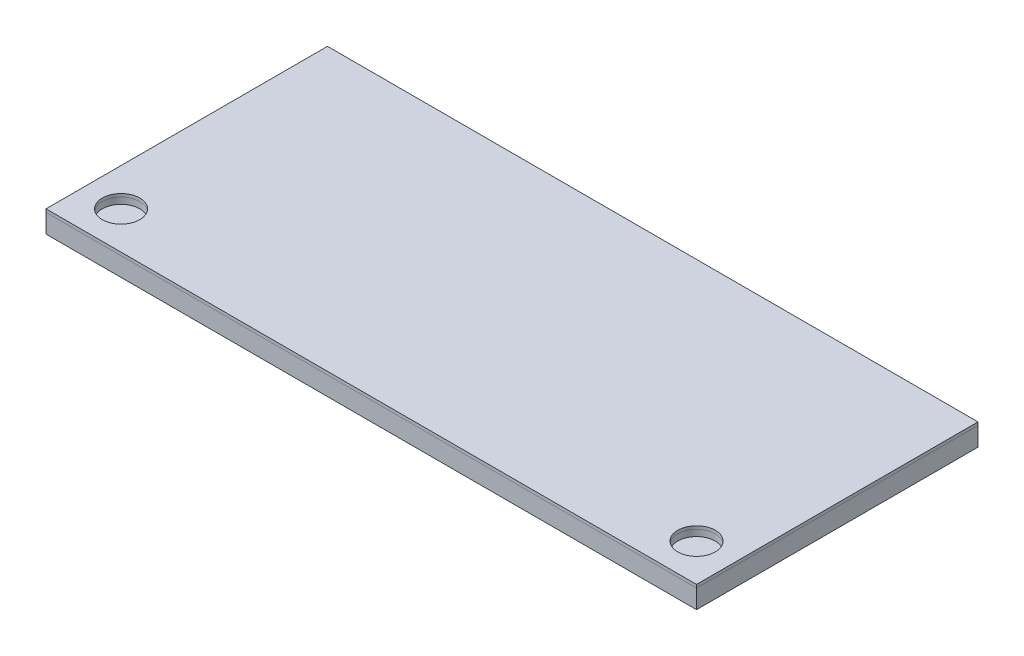
ISO-10303-21;
HEADER;
FILE_DESCRIPTION(('STEP AP214'),'2;1');
FILE_NAME('part.step','',(''),(''),'','','');
FILE_SCHEMA(('AUTOMOTIVE_DESIGN { 1 0 10303 214 1 1 1 1 }'));
ENDSEC;
DATA;
#1=APPLICATION_CONTEXT('core data for automotive mechanical design processes');
#2=APPLICATION_PROTOCOL_DEFINITION('international standard','automotive_design',2000,#1);
#3=PRODUCT_CONTEXT('',#1,'mechanical');
#4=PRODUCT('Part','Part','',(#3));
#5=PRODUCT_RELATED_PRODUCT_CATEGORY('part','',(#4));
#6=PRODUCT_DEFINITION_FORMATION('','',#4);
#7=PRODUCT_DEFINITION_CONTEXT('part definition',#1,'design');
#8=PRODUCT_DEFINITION('design','',#6,#7);
#9=PRODUCT_DEFINITION_SHAPE('','',#8);
#10=(LENGTH_UNIT() NAMED_UNIT(*) SI_UNIT(.MILLI.,.METRE.));
#11=(NAMED_UNIT(*) PLANE_ANGLE_UNIT() SI_UNIT($,.RADIAN.));
#12=(NAMED_UNIT(*) SI_UNIT($,.STERADIAN.) SOLID_ANGLE_UNIT());
#13=UNCERTAINTY_MEASURE_WITH_UNIT(LENGTH_MEASURE(1.E-05),#10,'distance_accuracy_value','');
#14=(GEOMETRIC_REPRESENTATION_CONTEXT(3) GLOBAL_UNCERTAINTY_ASSIGNED_CONTEXT((#13)) GLOBAL_UNIT_ASSIGNED_CONTEXT((#10,
#11,#12)) REPRESENTATION_CONTEXT('',''));
#15=CARTESIAN_POINT('',(0.,0.,0.));
#16=DIRECTION('',(0.,0.,1.));
#17=DIRECTION('',(1.,0.,0.));
#18=AXIS2_PLACEMENT_3D('',#15,#16,#17);
#19=CARTESIAN_POINT('',(-520.,0.,225.));
#20=DIRECTION('',(0.,1.,0.));
#21=DIRECTION('',(1.,0.,0.));
#22=AXIS2_PLACEMENT_3D('',#19,#20,#21);
#23=PLANE('',#22);
#24=DIRECTION('',(-1.,0.,0.));
#25=VECTOR('',#24,1.);
#26=CARTESIAN_POINT('',(0.,0.,0.));
#27=LINE('',#26,#25);
#28=CARTESIAN_POINT('',(0.,0.,0.));
#29=VERTEX_POINT('',#28);
#30=CARTESIAN_POINT('',(-1040.,0.,0.));
#31=VERTEX_POINT('',#30);
#32=EDGE_CURVE('P0_E28',#29,#31,#27,.T.);
#33=ORIENTED_EDGE('',*,*,#32,.F.);
#34=DIRECTION('',(0.,0.,-1.));
#35=VECTOR('',#34,1.);
#36=CARTESIAN_POINT('',(0.,0.,450.));
#37=LINE('',#36,#35);
#38=CARTESIAN_POINT('',(0.,0.,450.));
#39=VERTEX_POINT('',#38);
#40=EDGE_CURVE('P0_E80',#39,#29,#37,.T.);
#41=ORIENTED_EDGE('',*,*,#40,.F.);
#42=DIRECTION('',(1.,0.,0.));
#43=VECTOR('',#42,1.);
#44=CARTESIAN_POINT('',(-1040.,0.,450.));
#45=LINE('',#44,#43);
#46=CARTESIAN_POINT('',(-1040.,0.,450.));
#47=VERTEX_POINT('',#46);
#48=EDGE_CURVE('P0_E138',#47,#39,#45,.T.);
#49=ORIENTED_EDGE('',*,*,#48,.F.);
#50=DIRECTION('',(0.,0.,1.));
#51=VECTOR('',#50,1.);
#52=CARTESIAN_POINT('',(-1040.,0.,0.));
#53=LINE('',#52,#51);
#54=EDGE_CURVE('P0_E101',#31,#47,#53,.T.);
#55=ORIENTED_EDGE('',*,*,#54,.F.);
#56=EDGE_LOOP('',(#33,#41,#49,#55));
#57=FACE_BOUND('',#56,.T.);
#58=ADVANCED_FACE('P0_F17',(#57),#23,.F.);
#59=CARTESIAN_POINT('',(-520.,30.,225.));
#60=DIRECTION('',(0.,1.,0.));
#61=DIRECTION('',(1.,0.,0.));
#62=AXIS2_PLACEMENT_3D('',#59,#60,#61);
#63=PLANE('',#62);
#64=CARTESIAN_POINT('',(-980.,30.,390.));
#65=DIRECTION('',(0.,-1.,0.));
#66=DIRECTION('',(-1.,0.,0.));
#67=AXIS2_PLACEMENT_3D('',#64,#65,#66);
#68=CIRCLE('',#67,30.);
#69=CARTESIAN_POINT('',(-950.,30.,390.));
#70=VERTEX_POINT('',#69);
#71=EDGE_CURVE('P0_E90',#70,#70,#68,.T.);
#72=ORIENTED_EDGE('',*,*,#71,.T.);
#73=EDGE_LOOP('',(#72));
#74=FACE_BOUND('',#73,.T.);
#75=CARTESIAN_POINT('',(-60.,30.,390.));
#76=DIRECTION('',(0.,-1.,0.));
#77=DIRECTION('',(-1.,0.,0.));
#78=AXIS2_PLACEMENT_3D('',#75,#76,#77);
#79=CIRCLE('',#78,30.);
#80=CARTESIAN_POINT('',(-30.,30.,390.));
#81=VERTEX_POINT('',#80);
#82=EDGE_CURVE('P0_E94',#81,#81,#79,.T.);
#83=ORIENTED_EDGE('',*,*,#82,.T.);
#84=EDGE_LOOP('',(#83));
#85=FACE_BOUND('',#84,.T.);
#86=DIRECTION('',(-1.,0.,0.));
#87=VECTOR('',#86,1.);
#88=CARTESIAN_POINT('',(0.,30.,0.));
#89=LINE('',#88,#87);
#90=CARTESIAN_POINT('',(0.,30.,0.));
#91=VERTEX_POINT('',#90);
#92=CARTESIAN_POINT('',(-1040.,30.,0.));
#93=VERTEX_POINT('',#92);
#94=EDGE_CURVE('P0_E11',#91,#93,#89,.T.);
#95=ORIENTED_EDGE('',*,*,#94,.T.);
#96=DIRECTION('',(0.,0.,1.));
#97=VECTOR('',#96,1.);
#98=CARTESIAN_POINT('',(-1040.,30.,0.));
#99=LINE('',#98,#97);
#100=CARTESIAN_POINT('',(-1040.,30.,450.));
#101=VERTEX_POINT('',#100);
#102=EDGE_CURVE('P0_E99',#93,#101,#99,.T.);
#103=ORIENTED_EDGE('',*,*,#102,.T.);
#104=DIRECTION('',(1.,0.,0.));
#105=VECTOR('',#104,1.);
#106=CARTESIAN_POINT('',(-1040.,30.,450.));
#107=LINE('',#106,#105);
#108=CARTESIAN_POINT('',(0.,30.,450.));
#109=VERTEX_POINT('',#108);
#110=EDGE_CURVE('P0_E120',#101,#109,#107,.T.);
#111=ORIENTED_EDGE('',*,*,#110,.T.);
#112=DIRECTION('',(0.,0.,-1.));
#113=VECTOR('',#112,1.);
#114=CARTESIAN_POINT('',(0.,30.,450.));
#115=LINE('',#114,#113);
#116=EDGE_CURVE('P0_E141',#109,#91,#115,.T.);
#117=ORIENTED_EDGE('',*,*,#116,.T.);
#118=EDGE_LOOP('',(#95,#103,#111,#117));
#119=FACE_BOUND('',#118,.T.);
#120=ADVANCED_FACE('P0_F272',(#74,#85,#119),#63,.T.);
#121=CARTESIAN_POINT('',(0.,0.,0.));
#122=DIRECTION('',(0.,0.,-1.));
#123=DIRECTION('',(0.,-1.,0.));
#124=AXIS2_PLACEMENT_3D('',#121,#122,#123);
#125=PLANE('',#124);
#126=ORIENTED_EDGE('',*,*,#32,.T.);
#127=DIRECTION('',(0.,1.,0.));
#128=VECTOR('',#127,1.);
#129=CARTESIAN_POINT('',(-1040.,0.,0.));
#130=LINE('',#129,#128);
#131=EDGE_CURVE('P0_E21',#31,#93,#130,.T.);
#132=ORIENTED_EDGE('',*,*,#131,.T.);
#133=ORIENTED_EDGE('',*,*,#94,.F.);
#134=DIRECTION('',(0.,1.,0.));
#135=VECTOR('',#134,1.);
#136=CARTESIAN_POINT('',(0.,0.,0.));
#137=LINE('',#136,#135);
#138=EDGE_CURVE('P0_E88',#29,#91,#137,.T.);
#139=ORIENTED_EDGE('',*,*,#138,.F.);
#140=EDGE_LOOP('',(#126,#132,#133,#139));
#141=FACE_BOUND('',#140,.T.);
#142=ADVANCED_FACE('P0_F151',(#141),#125,.T.);
#143=CARTESIAN_POINT('',(-1040.,0.,0.));
#144=DIRECTION('',(-1.,0.,0.));
#145=DIRECTION('',(0.,0.,1.));
#146=AXIS2_PLACEMENT_3D('',#143,#144,#145);
#147=PLANE('',#146);
#148=ORIENTED_EDGE('',*,*,#54,.T.);
#149=DIRECTION('',(0.,1.,0.));
#150=VECTOR('',#149,1.);
#151=CARTESIAN_POINT('',(-1040.,0.,450.));
#152=LINE('',#151,#150);
#153=EDGE_CURVE('P0_E110',#47,#101,#152,.T.);
#154=ORIENTED_EDGE('',*,*,#153,.T.);
#155=ORIENTED_EDGE('',*,*,#102,.F.);
#156=ORIENTED_EDGE('',*,*,#131,.F.);
#157=EDGE_LOOP('',(#148,#154,#155,#156));
#158=FACE_BOUND('',#157,.T.);
#159=ADVANCED_FACE('P0_F155',(#158),#147,.T.);
#160=CARTESIAN_POINT('',(-1040.,0.,450.));
#161=DIRECTION('',(0.,0.,1.));
#162=DIRECTION('',(1.,0.,0.));
#163=AXIS2_PLACEMENT_3D('',#160,#161,#162);
#164=PLANE('',#163);
#165=ORIENTED_EDGE('',*,*,#48,.T.);
#166=DIRECTION('',(0.,1.,0.));
#167=VECTOR('',#166,1.);
#168=CARTESIAN_POINT('',(0.,0.,450.));
#169=LINE('',#168,#167);
#170=EDGE_CURVE('P0_E124',#39,#109,#169,.T.);
#171=ORIENTED_EDGE('',*,*,#170,.T.);
#172=ORIENTED_EDGE('',*,*,#110,.F.);
#173=ORIENTED_EDGE('',*,*,#153,.F.);
#174=EDGE_LOOP('',(#165,#171,#172,#173));
#175=FACE_BOUND('',#174,.T.);
#176=ADVANCED_FACE('P0_F161',(#175),#164,.T.);
#177=CARTESIAN_POINT('',(0.,0.,450.));
#178=DIRECTION('',(1.,0.,0.));
#179=DIRECTION('',(0.,1.,0.));
#180=AXIS2_PLACEMENT_3D('',#177,#178,#179);
#181=PLANE('',#180);
#182=ORIENTED_EDGE('',*,*,#40,.T.);
#183=ORIENTED_EDGE('',*,*,#138,.T.);
#184=ORIENTED_EDGE('',*,*,#116,.F.);
#185=ORIENTED_EDGE('',*,*,#170,.F.);
#186=EDGE_LOOP('',(#182,#183,#184,#185));
#187=FACE_BOUND('',#186,.T.);
#188=ADVANCED_FACE('P0_F165',(#187),#181,.T.);
#189=CARTESIAN_POINT('',(-980.,20.,390.));
#190=DIRECTION('',(0.,1.,0.));
#191=DIRECTION('',(1.,0.,0.));
#192=AXIS2_PLACEMENT_3D('',#189,#190,#191);
#193=PLANE('',#192);
#194=CARTESIAN_POINT('',(-980.,20.,390.));
#195=DIRECTION('',(0.,-1.,0.));
#196=DIRECTION('',(-1.,0.,0.));
#197=AXIS2_PLACEMENT_3D('',#194,#195,#196);
#198=CIRCLE('',#197,30.);
#199=CARTESIAN_POINT('',(-950.,20.,390.));
#200=VERTEX_POINT('',#199);
#201=EDGE_CURVE('P0_E73',#200,#200,#198,.T.);
#202=ORIENTED_EDGE('',*,*,#201,.F.);
#203=EDGE_LOOP('',(#202));
#204=FACE_BOUND('',#203,.T.);
#205=ADVANCED_FACE('P0_F227',(#204),#193,.T.);
#206=CARTESIAN_POINT('',(-980.,30.,390.));
#207=DIRECTION('',(0.,-1.,0.));
#208=DIRECTION('',(-1.,0.,0.));
#209=AXIS2_PLACEMENT_3D('',#206,#207,#208);
#210=CYLINDRICAL_SURFACE('',#209,30.);
#211=ORIENTED_EDGE('',*,*,#71,.F.);
#212=DIRECTION('',(0.,-1.,0.));
#213=VECTOR('',#212,1.);
#214=CARTESIAN_POINT('',(-950.,30.,390.));
#215=LINE('',#214,#213);
#216=EDGE_CURVE('P0_E76',#70,#200,#215,.T.);
#217=ORIENTED_EDGE('',*,*,#216,.T.);
#218=ORIENTED_EDGE('',*,*,#201,.T.);
#219=ORIENTED_EDGE('',*,*,#216,.F.);
#220=EDGE_LOOP('',(#211,#217,#218,#219));
#221=FACE_BOUND('',#220,.T.);
#222=ADVANCED_FACE('P0_F75',(#221),#210,.F.);
#223=CARTESIAN_POINT('',(-60.,20.,390.));
#224=DIRECTION('',(0.,1.,0.));
#225=DIRECTION('',(1.,0.,0.));
#226=AXIS2_PLACEMENT_3D('',#223,#224,#225);
#227=PLANE('',#226);
#228=CARTESIAN_POINT('',(-60.,20.,390.));
#229=DIRECTION('',(0.,-1.,0.));
#230=DIRECTION('',(-1.,0.,0.));
#231=AXIS2_PLACEMENT_3D('',#228,#229,#230);
#232=CIRCLE('',#231,30.);
#233=CARTESIAN_POINT('',(-30.,20.,390.));
#234=VERTEX_POINT('',#233);
#235=EDGE_CURVE('P0_E98',#234,#234,#232,.T.);
#236=ORIENTED_EDGE('',*,*,#235,.F.);
#237=EDGE_LOOP('',(#236));
#238=FACE_BOUND('',#237,.T.);
#239=ADVANCED_FACE('P0_F203',(#238),#227,.T.);
#240=CARTESIAN_POINT('',(-60.,30.,390.));
#241=DIRECTION('',(0.,-1.,0.));
#242=DIRECTION('',(-1.,0.,0.));
#243=AXIS2_PLACEMENT_3D('',#240,#241,#242);
#244=CYLINDRICAL_SURFACE('',#243,30.);
#245=ORIENTED_EDGE('',*,*,#82,.F.);
#246=DIRECTION('',(0.,-1.,0.));
#247=VECTOR('',#246,1.);
#248=CARTESIAN_POINT('',(-30.,30.,390.));
#249=LINE('',#248,#247);
#250=EDGE_CURVE('P0_E95',#81,#234,#249,.T.);
#251=ORIENTED_EDGE('',*,*,#250,.T.);
#252=ORIENTED_EDGE('',*,*,#235,.T.);
#253=ORIENTED_EDGE('',*,*,#250,.F.);
#254=EDGE_LOOP('',(#245,#251,#252,#253));
#255=FACE_BOUND('',#254,.T.);
#256=ADVANCED_FACE('P0_F19',(#255),#244,.F.);
#257=CLOSED_SHELL('',(#58,#120,#142,#159,#176,#188,#205,#222,#239,#256));
#258=MANIFOLD_SOLID_BREP('P0_B1',#257);
#259=CARTESIAN_POINT('',(-520.,30.,225.));
#260=DIRECTION('',(0.,1.,0.));
#261=DIRECTION('',(1.,0.,0.));
#262=AXIS2_PLACEMENT_3D('',#259,#260,#261);
#263=PLANE('',#262);
#264=CARTESIAN_POINT('',(-60.,30.,390.));
#265=DIRECTION('',(0.,1.,0.));
#266=DIRECTION('',(-1.,0.,0.));
#267=AXIS2_PLACEMENT_3D('',#264,#265,#266);
#268=CIRCLE('',#267,30.);
#269=CARTESIAN_POINT('',(-30.,30.,390.));
#270=VERTEX_POINT('',#269);
#271=EDGE_CURVE('P1_E131',#270,#270,#268,.T.);
#272=ORIENTED_EDGE('',*,*,#271,.T.);
#273=EDGE_LOOP('',(#272));
#274=FACE_BOUND('',#273,.T.);
#275=CARTESIAN_POINT('',(-980.,30.,390.));
#276=DIRECTION('',(0.,1.,0.));
#277=DIRECTION('',(-1.,0.,0.));
#278=AXIS2_PLACEMENT_3D('',#275,#276,#277);
#279=CIRCLE('',#278,30.);
#280=CARTESIAN_POINT('',(-950.,30.,390.));
#281=VERTEX_POINT('',#280);
#282=EDGE_CURVE('P1_E151',#281,#281,#279,.T.);
#283=ORIENTED_EDGE('',*,*,#282,.T.);
#284=EDGE_LOOP('',(#283));
#285=FACE_BOUND('',#284,.T.);
#286=DIRECTION('',(-1.,0.,0.));
#287=VECTOR('',#286,1.);
#288=CARTESIAN_POINT('',(0.,30.,0.));
#289=LINE('',#288,#287);
#290=CARTESIAN_POINT('',(0.,30.,0.));
#291=VERTEX_POINT('',#290);
#292=CARTESIAN_POINT('',(-1040.,30.,0.));
#293=VERTEX_POINT('',#292);
#294=EDGE_CURVE('P1_E28',#291,#293,#289,.T.);
#295=ORIENTED_EDGE('',*,*,#294,.F.);
#296=DIRECTION('',(0.,0.,-1.));
#297=VECTOR('',#296,1.);
#298=CARTESIAN_POINT('',(0.,30.,450.));
#299=LINE('',#298,#297);
#300=CARTESIAN_POINT('',(0.,30.,450.));
#301=VERTEX_POINT('',#300);
#302=EDGE_CURVE('P1_E117',#301,#291,#299,.T.);
#303=ORIENTED_EDGE('',*,*,#302,.F.);
#304=DIRECTION('',(1.,0.,0.));
#305=VECTOR('',#304,1.);
#306=CARTESIAN_POINT('',(-1040.,30.,450.));
#307=LINE('',#306,#305);
#308=CARTESIAN_POINT('',(-1040.,30.,450.));
#309=VERTEX_POINT('',#308);
#310=EDGE_CURVE('P1_E100',#309,#301,#307,.T.);
#311=ORIENTED_EDGE('',*,*,#310,.F.);
#312=DIRECTION('',(0.,0.,1.));
#313=VECTOR('',#312,1.);
#314=CARTESIAN_POINT('',(-1040.,30.,0.));
#315=LINE('',#314,#313);
#316=EDGE_CURVE('P1_E130',#293,#309,#315,.T.);
#317=ORIENTED_EDGE('',*,*,#316,.F.);
#318=EDGE_LOOP('',(#295,#303,#311,#317));
#319=FACE_BOUND('',#318,.T.);
#320=ADVANCED_FACE('P1_F17',(#274,#285,#319),#263,.F.);
#321=CARTESIAN_POINT('',(-520.,35.,225.));
#322=DIRECTION('',(0.,1.,0.));
#323=DIRECTION('',(1.,0.,0.));
#324=AXIS2_PLACEMENT_3D('',#321,#322,#323);
#325=PLANE('',#324);
#326=CARTESIAN_POINT('',(-60.,35.,390.));
#327=DIRECTION('',(0.,-1.,0.));
#328=DIRECTION('',(-1.,0.,0.));
#329=AXIS2_PLACEMENT_3D('',#326,#327,#328);
#330=CIRCLE('',#329,30.);
#331=CARTESIAN_POINT('',(-30.,35.,390.));
#332=VERTEX_POINT('',#331);
#333=EDGE_CURVE('P1_E122',#332,#332,#330,.T.);
#334=ORIENTED_EDGE('',*,*,#333,.T.);
#335=EDGE_LOOP('',(#334));
#336=FACE_BOUND('',#335,.T.);
#337=CARTESIAN_POINT('',(-980.,35.,390.));
#338=DIRECTION('',(0.,-1.,0.));
#339=DIRECTION('',(-1.,0.,0.));
#340=AXIS2_PLACEMENT_3D('',#337,#338,#339);
#341=CIRCLE('',#340,30.);
#342=CARTESIAN_POINT('',(-950.,35.,390.));
#343=VERTEX_POINT('',#342);
#344=EDGE_CURVE('P1_E126',#343,#343,#341,.T.);
#345=ORIENTED_EDGE('',*,*,#344,.T.);
#346=EDGE_LOOP('',(#345));
#347=FACE_BOUND('',#346,.T.);
#348=DIRECTION('',(-1.,0.,0.));
#349=VECTOR('',#348,1.);
#350=CARTESIAN_POINT('',(0.,35.,0.));
#351=LINE('',#350,#349);
#352=CARTESIAN_POINT('',(0.,35.,0.));
#353=VERTEX_POINT('',#352);
#354=CARTESIAN_POINT('',(-1040.,35.,0.));
#355=VERTEX_POINT('',#354);
#356=EDGE_CURVE('P1_E11',#353,#355,#351,.T.);
#357=ORIENTED_EDGE('',*,*,#356,.T.);
#358=DIRECTION('',(0.,0.,1.));
#359=VECTOR('',#358,1.);
#360=CARTESIAN_POINT('',(-1040.,35.,0.));
#361=LINE('',#360,#359);
#362=CARTESIAN_POINT('',(-1040.,35.,450.));
#363=VERTEX_POINT('',#362);
#364=EDGE_CURVE('P1_E94',#355,#363,#361,.T.);
#365=ORIENTED_EDGE('',*,*,#364,.T.);
#366=DIRECTION('',(1.,0.,0.));
#367=VECTOR('',#366,1.);
#368=CARTESIAN_POINT('',(-1040.,35.,450.));
#369=LINE('',#368,#367);
#370=CARTESIAN_POINT('',(0.,35.,450.));
#371=VERTEX_POINT('',#370);
#372=EDGE_CURVE('P1_E88',#363,#371,#369,.T.);
#373=ORIENTED_EDGE('',*,*,#372,.T.);
#374=DIRECTION('',(0.,0.,-1.));
#375=VECTOR('',#374,1.);
#376=CARTESIAN_POINT('',(0.,35.,450.));
#377=LINE('',#376,#375);
#378=EDGE_CURVE('P1_E21',#371,#353,#377,.T.);
#379=ORIENTED_EDGE('',*,*,#378,.T.);
#380=EDGE_LOOP('',(#357,#365,#373,#379));
#381=FACE_BOUND('',#380,.T.);
#382=ADVANCED_FACE('P1_F90',(#336,#347,#381),#325,.T.);
#383=CARTESIAN_POINT('',(0.,30.,0.));
#384=DIRECTION('',(0.,0.,-1.));
#385=DIRECTION('',(0.,-1.,0.));
#386=AXIS2_PLACEMENT_3D('',#383,#384,#385);
#387=PLANE('',#386);
#388=ORIENTED_EDGE('',*,*,#294,.T.);
#389=DIRECTION('',(0.,1.,0.));
#390=VECTOR('',#389,1.);
#391=CARTESIAN_POINT('',(-1040.,30.,0.));
#392=LINE('',#391,#390);
#393=EDGE_CURVE('P1_E129',#293,#355,#392,.T.);
#394=ORIENTED_EDGE('',*,*,#393,.T.);
#395=ORIENTED_EDGE('',*,*,#356,.F.);
#396=DIRECTION('',(0.,1.,0.));
#397=VECTOR('',#396,1.);
#398=CARTESIAN_POINT('',(0.,30.,0.));
#399=LINE('',#398,#397);
#400=EDGE_CURVE('P1_E111',#291,#353,#399,.T.);
#401=ORIENTED_EDGE('',*,*,#400,.F.);
#402=EDGE_LOOP('',(#388,#394,#395,#401));
#403=FACE_BOUND('',#402,.T.);
#404=ADVANCED_FACE('P1_F169',(#403),#387,.T.);
#405=CARTESIAN_POINT('',(-1040.,30.,0.));
#406=DIRECTION('',(-1.,0.,0.));
#407=DIRECTION('',(0.,0.,1.));
#408=AXIS2_PLACEMENT_3D('',#405,#406,#407);
#409=PLANE('',#408);
#410=ORIENTED_EDGE('',*,*,#316,.T.);
#411=DIRECTION('',(0.,1.,0.));
#412=VECTOR('',#411,1.);
#413=CARTESIAN_POINT('',(-1040.,30.,450.));
#414=LINE('',#413,#412);
#415=EDGE_CURVE('P1_E99',#309,#363,#414,.T.);
#416=ORIENTED_EDGE('',*,*,#415,.T.);
#417=ORIENTED_EDGE('',*,*,#364,.F.);
#418=ORIENTED_EDGE('',*,*,#393,.F.);
#419=EDGE_LOOP('',(#410,#416,#417,#418));
#420=FACE_BOUND('',#419,.T.);
#421=ADVANCED_FACE('P1_F19',(#420),#409,.T.);
#422=CARTESIAN_POINT('',(-1040.,30.,450.));
#423=DIRECTION('',(0.,0.,1.));
#424=DIRECTION('',(1.,0.,0.));
#425=AXIS2_PLACEMENT_3D('',#422,#423,#424);
#426=PLANE('',#425);
#427=ORIENTED_EDGE('',*,*,#310,.T.);
#428=DIRECTION('',(0.,1.,0.));
#429=VECTOR('',#428,1.);
#430=CARTESIAN_POINT('',(0.,30.,450.));
#431=LINE('',#430,#429);
#432=EDGE_CURVE('P1_E103',#301,#371,#431,.T.);
#433=ORIENTED_EDGE('',*,*,#432,.T.);
#434=ORIENTED_EDGE('',*,*,#372,.F.);
#435=ORIENTED_EDGE('',*,*,#415,.F.);
#436=EDGE_LOOP('',(#427,#433,#434,#435));
#437=FACE_BOUND('',#436,.T.);
#438=ADVANCED_FACE('P1_F104',(#437),#426,.T.);
#439=CARTESIAN_POINT('',(0.,30.,450.));
#440=DIRECTION('',(1.,0.,0.));
#441=DIRECTION('',(0.,1.,0.));
#442=AXIS2_PLACEMENT_3D('',#439,#440,#441);
#443=PLANE('',#442);
#444=ORIENTED_EDGE('',*,*,#302,.T.);
#445=ORIENTED_EDGE('',*,*,#400,.T.);
#446=ORIENTED_EDGE('',*,*,#378,.F.);
#447=ORIENTED_EDGE('',*,*,#432,.F.);
#448=EDGE_LOOP('',(#444,#445,#446,#447));
#449=FACE_BOUND('',#448,.T.);
#450=ADVANCED_FACE('P1_F110',(#449),#443,.T.);
#451=CARTESIAN_POINT('',(-60.,30.,390.));
#452=DIRECTION('',(0.,1.,0.));
#453=DIRECTION('',(-1.,0.,0.));
#454=AXIS2_PLACEMENT_3D('',#451,#452,#453);
#455=CYLINDRICAL_SURFACE('',#454,30.);
#456=ORIENTED_EDGE('',*,*,#271,.F.);
#457=DIRECTION('',(0.,1.,0.));
#458=VECTOR('',#457,1.);
#459=CARTESIAN_POINT('',(-30.,30.,390.));
#460=LINE('',#459,#458);
#461=EDGE_CURVE('P1_E134',#270,#332,#460,.T.);
#462=ORIENTED_EDGE('',*,*,#461,.T.);
#463=ORIENTED_EDGE('',*,*,#333,.F.);
#464=ORIENTED_EDGE('',*,*,#461,.F.);
#465=EDGE_LOOP('',(#456,#462,#463,#464));
#466=FACE_BOUND('',#465,.T.);
#467=ADVANCED_FACE('P1_F215',(#466),#455,.F.);
#468=CARTESIAN_POINT('',(-980.,30.,390.));
#469=DIRECTION('',(0.,1.,0.));
#470=DIRECTION('',(-1.,0.,0.));
#471=AXIS2_PLACEMENT_3D('',#468,#469,#470);
#472=CYLINDRICAL_SURFACE('',#471,30.);
#473=ORIENTED_EDGE('',*,*,#282,.F.);
#474=DIRECTION('',(0.,1.,0.));
#475=VECTOR('',#474,1.);
#476=CARTESIAN_POINT('',(-950.,30.,390.));
#477=LINE('',#476,#475);
#478=EDGE_CURVE('P1_E144',#281,#343,#477,.T.);
#479=ORIENTED_EDGE('',*,*,#478,.T.);
#480=ORIENTED_EDGE('',*,*,#344,.F.);
#481=ORIENTED_EDGE('',*,*,#478,.F.);
#482=EDGE_LOOP('',(#473,#479,#480,#481));
#483=FACE_BOUND('',#482,.T.);
#484=ADVANCED_FACE('P1_F209',(#483),#472,.F.);
#485=CLOSED_SHELL('',(#320,#382,#404,#421,#438,#450,#467,#484));
#486=MANIFOLD_SOLID_BREP('P1_B1',#485);
#487=ADVANCED_BREP_SHAPE_REPRESENTATION('',(#18,#258,#486),#14);
#488=SHAPE_DEFINITION_REPRESENTATION(#9,#487);
ENDSEC;
END-ISO-10303-21;
